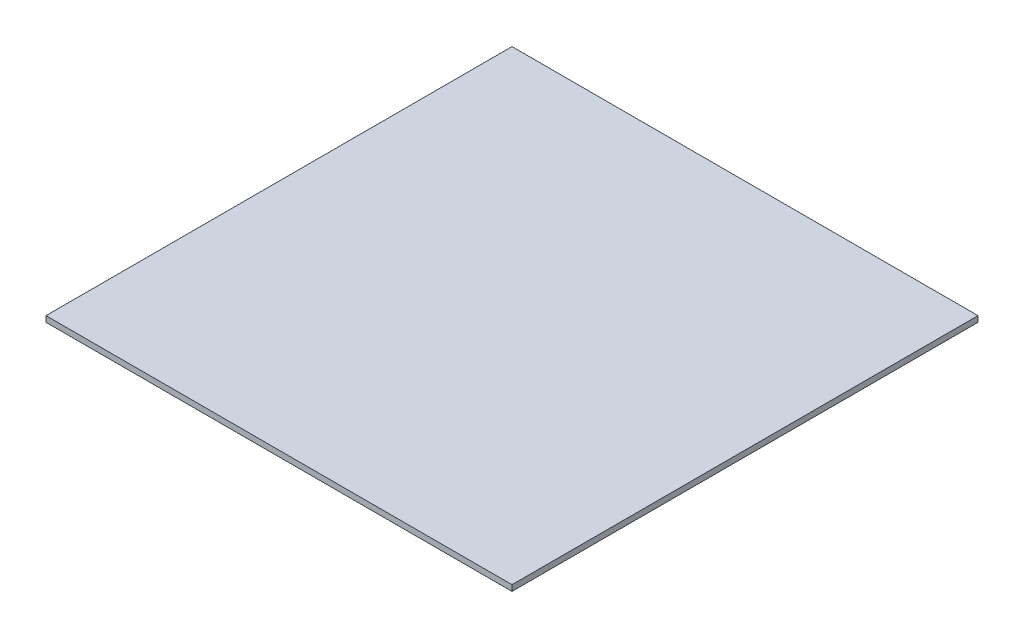
ISO-10303-21;
HEADER;
FILE_DESCRIPTION(('STEP AP214'),'2;1');
FILE_NAME('part.step','',(''),(''),'','','');
FILE_SCHEMA(('AUTOMOTIVE_DESIGN { 1 0 10303 214 1 1 1 1 }'));
ENDSEC;
DATA;
#1=APPLICATION_CONTEXT('core data for automotive mechanical design processes');
#2=APPLICATION_PROTOCOL_DEFINITION('international standard','automotive_design',2000,#1);
#3=PRODUCT_CONTEXT('',#1,'mechanical');
#4=PRODUCT('Part','Part','',(#3));
#5=PRODUCT_RELATED_PRODUCT_CATEGORY('part','',(#4));
#6=PRODUCT_DEFINITION_FORMATION('','',#4);
#7=PRODUCT_DEFINITION_CONTEXT('part definition',#1,'design');
#8=PRODUCT_DEFINITION('design','',#6,#7);
#9=PRODUCT_DEFINITION_SHAPE('','',#8);
#10=(LENGTH_UNIT() NAMED_UNIT(*) SI_UNIT(.MILLI.,.METRE.));
#11=(NAMED_UNIT(*) PLANE_ANGLE_UNIT() SI_UNIT($,.RADIAN.));
#12=(NAMED_UNIT(*) SI_UNIT($,.STERADIAN.) SOLID_ANGLE_UNIT());
#13=UNCERTAINTY_MEASURE_WITH_UNIT(LENGTH_MEASURE(1.E-05),#10,'distance_accuracy_value','');
#14=(GEOMETRIC_REPRESENTATION_CONTEXT(3) GLOBAL_UNCERTAINTY_ASSIGNED_CONTEXT((#13)) GLOBAL_UNIT_ASSIGNED_CONTEXT((#10,
#11,#12)) REPRESENTATION_CONTEXT('',''));
#15=CARTESIAN_POINT('',(0.,0.,0.));
#16=DIRECTION('',(0.,0.,1.));
#17=DIRECTION('',(1.,0.,0.));
#18=AXIS2_PLACEMENT_3D('',#15,#16,#17);
#19=CARTESIAN_POINT('',(0.,1.5,0.));
#20=DIRECTION('',(1.,0.,0.));
#21=DIRECTION('',(0.,0.,-1.));
#22=AXIS2_PLACEMENT_3D('',#19,#20,#21);
#23=PLANE('',#22);
#24=DIRECTION('',(0.,0.,1.));
#25=VECTOR('',#24,1.);
#26=CARTESIAN_POINT('',(0.,0.,0.));
#27=LINE('',#26,#25);
#28=CARTESIAN_POINT('',(0.,0.,-120.));
#29=VERTEX_POINT('',#28);
#30=CARTESIAN_POINT('',(0.,0.,0.));
#31=VERTEX_POINT('',#30);
#32=EDGE_CURVE('E96',#29,#31,#27,.T.);
#33=ORIENTED_EDGE('',*,*,#32,.T.);
#34=DIRECTION('',(0.,-1.,0.));
#35=VECTOR('',#34,1.);
#36=CARTESIAN_POINT('',(0.,1.5,0.));
#37=LINE('',#36,#35);
#38=CARTESIAN_POINT('',(0.,1.5,0.));
#39=VERTEX_POINT('',#38);
#40=EDGE_CURVE('E11',#39,#31,#37,.T.);
#41=ORIENTED_EDGE('',*,*,#40,.F.);
#42=DIRECTION('',(0.,0.,1.));
#43=VECTOR('',#42,1.);
#44=CARTESIAN_POINT('',(0.,1.5,0.));
#45=LINE('',#44,#43);
#46=CARTESIAN_POINT('',(0.,1.5,-120.));
#47=VERTEX_POINT('',#46);
#48=EDGE_CURVE('E84',#47,#39,#45,.T.);
#49=ORIENTED_EDGE('',*,*,#48,.F.);
#50=DIRECTION('',(0.,-1.,0.));
#51=VECTOR('',#50,1.);
#52=CARTESIAN_POINT('',(0.,1.5,-120.));
#53=LINE('',#52,#51);
#54=EDGE_CURVE('E92',#47,#29,#53,.T.);
#55=ORIENTED_EDGE('',*,*,#54,.T.);
#56=EDGE_LOOP('',(#33,#41,#49,#55));
#57=FACE_BOUND('',#56,.T.);
#58=ADVANCED_FACE('F33',(#57),#23,.F.);
#59=CARTESIAN_POINT('',(0.,1.5,0.));
#60=DIRECTION('',(0.,0.,-1.));
#61=DIRECTION('',(-1.,0.,0.));
#62=AXIS2_PLACEMENT_3D('',#59,#60,#61);
#63=PLANE('',#62);
#64=DIRECTION('',(1.,0.,0.));
#65=VECTOR('',#64,1.);
#66=CARTESIAN_POINT('',(0.,0.,0.));
#67=LINE('',#66,#65);
#68=CARTESIAN_POINT('',(120.,0.,0.));
#69=VERTEX_POINT('',#68);
#70=EDGE_CURVE('E88',#31,#69,#67,.T.);
#71=ORIENTED_EDGE('',*,*,#70,.T.);
#72=DIRECTION('',(0.,-1.,0.));
#73=VECTOR('',#72,1.);
#74=CARTESIAN_POINT('',(120.,1.5,0.));
#75=LINE('',#74,#73);
#76=CARTESIAN_POINT('',(120.,1.5,0.));
#77=VERTEX_POINT('',#76);
#78=EDGE_CURVE('E41',#77,#69,#75,.T.);
#79=ORIENTED_EDGE('',*,*,#78,.F.);
#80=DIRECTION('',(1.,0.,0.));
#81=VECTOR('',#80,1.);
#82=CARTESIAN_POINT('',(0.,1.5,0.));
#83=LINE('',#82,#81);
#84=EDGE_CURVE('E79',#39,#77,#83,.T.);
#85=ORIENTED_EDGE('',*,*,#84,.F.);
#86=ORIENTED_EDGE('',*,*,#40,.T.);
#87=EDGE_LOOP('',(#71,#79,#85,#86));
#88=FACE_BOUND('',#87,.T.);
#89=ADVANCED_FACE('F87',(#88),#63,.F.);
#90=CARTESIAN_POINT('',(120.,1.5,0.));
#91=DIRECTION('',(-1.,0.,0.));
#92=DIRECTION('',(0.,0.,1.));
#93=AXIS2_PLACEMENT_3D('',#90,#91,#92);
#94=PLANE('',#93);
#95=DIRECTION('',(0.,0.,-1.));
#96=VECTOR('',#95,1.);
#97=CARTESIAN_POINT('',(120.,0.,0.));
#98=LINE('',#97,#96);
#99=CARTESIAN_POINT('',(120.,0.,-120.));
#100=VERTEX_POINT('',#99);
#101=EDGE_CURVE('E66',#69,#100,#98,.T.);
#102=ORIENTED_EDGE('',*,*,#101,.T.);
#103=DIRECTION('',(0.,-1.,0.));
#104=VECTOR('',#103,1.);
#105=CARTESIAN_POINT('',(120.,1.5,-120.));
#106=LINE('',#105,#104);
#107=CARTESIAN_POINT('',(120.,1.5,-120.));
#108=VERTEX_POINT('',#107);
#109=EDGE_CURVE('E89',#108,#100,#106,.T.);
#110=ORIENTED_EDGE('',*,*,#109,.F.);
#111=DIRECTION('',(0.,0.,-1.));
#112=VECTOR('',#111,1.);
#113=CARTESIAN_POINT('',(120.,1.5,0.));
#114=LINE('',#113,#112);
#115=EDGE_CURVE('E82',#77,#108,#114,.T.);
#116=ORIENTED_EDGE('',*,*,#115,.F.);
#117=ORIENTED_EDGE('',*,*,#78,.T.);
#118=EDGE_LOOP('',(#102,#110,#116,#117));
#119=FACE_BOUND('',#118,.T.);
#120=ADVANCED_FACE('F90',(#119),#94,.F.);
#121=CARTESIAN_POINT('',(0.,1.5,-120.));
#122=DIRECTION('',(0.,0.,1.));
#123=DIRECTION('',(1.,0.,0.));
#124=AXIS2_PLACEMENT_3D('',#121,#122,#123);
#125=PLANE('',#124);
#126=DIRECTION('',(-1.,0.,0.));
#127=VECTOR('',#126,1.);
#128=CARTESIAN_POINT('',(0.,0.,-120.));
#129=LINE('',#128,#127);
#130=EDGE_CURVE('E72',#100,#29,#129,.T.);
#131=ORIENTED_EDGE('',*,*,#130,.T.);
#132=ORIENTED_EDGE('',*,*,#54,.F.);
#133=DIRECTION('',(-1.,0.,0.));
#134=VECTOR('',#133,1.);
#135=CARTESIAN_POINT('',(0.,1.5,-120.));
#136=LINE('',#135,#134);
#137=EDGE_CURVE('E49',#108,#47,#136,.T.);
#138=ORIENTED_EDGE('',*,*,#137,.F.);
#139=ORIENTED_EDGE('',*,*,#109,.T.);
#140=EDGE_LOOP('',(#131,#132,#138,#139));
#141=FACE_BOUND('',#140,.T.);
#142=ADVANCED_FACE('F103',(#141),#125,.F.);
#143=CARTESIAN_POINT('',(0.,1.5,-120.));
#144=DIRECTION('',(0.,-1.,0.));
#145=DIRECTION('',(0.,0.,-1.));
#146=AXIS2_PLACEMENT_3D('',#143,#144,#145);
#147=PLANE('',#146);
#148=ORIENTED_EDGE('',*,*,#48,.T.);
#149=ORIENTED_EDGE('',*,*,#84,.T.);
#150=ORIENTED_EDGE('',*,*,#115,.T.);
#151=ORIENTED_EDGE('',*,*,#137,.T.);
#152=EDGE_LOOP('',(#148,#149,#150,#151));
#153=FACE_BOUND('',#152,.T.);
#154=ADVANCED_FACE('F80',(#153),#147,.F.);
#155=CARTESIAN_POINT('',(0.,0.,-120.));
#156=DIRECTION('',(0.,-1.,0.));
#157=DIRECTION('',(0.,0.,-1.));
#158=AXIS2_PLACEMENT_3D('',#155,#156,#157);
#159=PLANE('',#158);
#160=ORIENTED_EDGE('',*,*,#32,.F.);
#161=ORIENTED_EDGE('',*,*,#130,.F.);
#162=ORIENTED_EDGE('',*,*,#101,.F.);
#163=ORIENTED_EDGE('',*,*,#70,.F.);
#164=EDGE_LOOP('',(#160,#161,#162,#163));
#165=FACE_BOUND('',#164,.T.);
#166=ADVANCED_FACE('F106',(#165),#159,.T.);
#167=CLOSED_SHELL('',(#58,#89,#120,#142,#154,#166));
#168=MANIFOLD_SOLID_BREP('B2',#167);
#169=ADVANCED_BREP_SHAPE_REPRESENTATION('',(#18,#168),#14);
#170=SHAPE_DEFINITION_REPRESENTATION(#9,#169);
ENDSEC;
END-ISO-10303-21;
